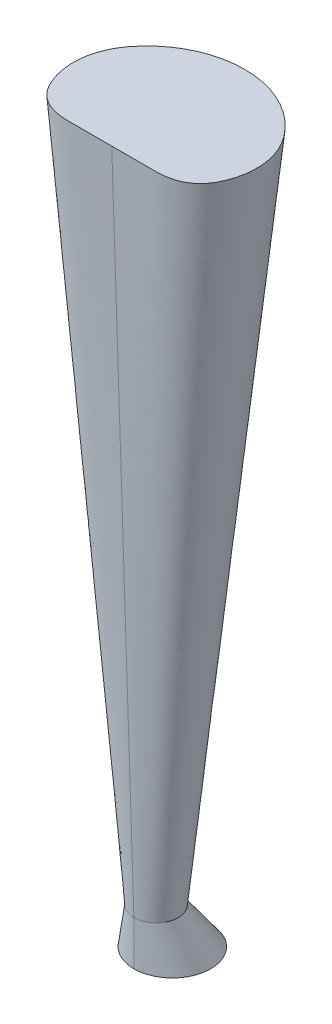
ISO-10303-21;
HEADER;
FILE_DESCRIPTION(('STEP AP214'),'2;1');
FILE_NAME('part.step','',(''),(''),'','','');
FILE_SCHEMA(('AUTOMOTIVE_DESIGN { 1 0 10303 214 1 1 1 1 }'));
ENDSEC;
DATA;
#1=APPLICATION_CONTEXT('core data for automotive mechanical design processes');
#2=APPLICATION_PROTOCOL_DEFINITION('international standard','automotive_design',2000,#1);
#3=PRODUCT_CONTEXT('',#1,'mechanical');
#4=PRODUCT('Part','Part','',(#3));
#5=PRODUCT_RELATED_PRODUCT_CATEGORY('part','',(#4));
#6=PRODUCT_DEFINITION_FORMATION('','',#4);
#7=PRODUCT_DEFINITION_CONTEXT('part definition',#1,'design');
#8=PRODUCT_DEFINITION('design','',#6,#7);
#9=PRODUCT_DEFINITION_SHAPE('','',#8);
#10=(LENGTH_UNIT() NAMED_UNIT(*) SI_UNIT(.MILLI.,.METRE.));
#11=(NAMED_UNIT(*) PLANE_ANGLE_UNIT() SI_UNIT($,.RADIAN.));
#12=(NAMED_UNIT(*) SI_UNIT($,.STERADIAN.) SOLID_ANGLE_UNIT());
#13=UNCERTAINTY_MEASURE_WITH_UNIT(LENGTH_MEASURE(1.E-05),#10,'distance_accuracy_value','');
#14=(GEOMETRIC_REPRESENTATION_CONTEXT(3) GLOBAL_UNCERTAINTY_ASSIGNED_CONTEXT((#13)) GLOBAL_UNIT_ASSIGNED_CONTEXT((#10,
#11,#12)) REPRESENTATION_CONTEXT('',''));
#15=CARTESIAN_POINT('',(0.,0.,0.));
#16=DIRECTION('',(0.,0.,1.));
#17=DIRECTION('',(1.,0.,0.));
#18=AXIS2_PLACEMENT_3D('',#15,#16,#17);
#19=CARTESIAN_POINT('',(15.,0.,-20.));
#20=DIRECTION('',(0.,1.,0.));
#21=DIRECTION('',(0.,0.,1.));
#22=AXIS2_PLACEMENT_3D('',#19,#20,#21);
#23=PLANE('',#22);
#24=DIRECTION('',(1.,0.,0.));
#25=VECTOR('',#24,1.);
#26=CARTESIAN_POINT('',(0.,0.,0.));
#27=LINE('',#26,#25);
#28=CARTESIAN_POINT('',(0.,0.,0.));
#29=VERTEX_POINT('',#28);
#30=CARTESIAN_POINT('',(15.0000000000151,0.,0.));
#31=VERTEX_POINT('',#30);
#32=EDGE_CURVE('E389',#29,#31,#27,.T.);
#33=ORIENTED_EDGE('',*,*,#32,.T.);
#34=CARTESIAN_POINT('',(15.,0.,-20.));
#35=DIRECTION('',(0.,1.,0.));
#36=DIRECTION('',(0.,0.,1.));
#37=AXIS2_PLACEMENT_3D('',#34,#35,#36);
#38=CIRCLE('',#37,20.);
#39=CARTESIAN_POINT('',(20.3291783772851,0.,-0.723074471714181));
#40=VERTEX_POINT('',#39);
#41=EDGE_CURVE('E170',#31,#40,#38,.T.);
#42=ORIENTED_EDGE('',*,*,#41,.T.);
#43=CARTESIAN_POINT('',(16.8652124320368,0.,-13.2530760650964));
#44=DIRECTION('',(0.,1.,0.));
#45=DIRECTION('',(0.,0.,1.));
#46=AXIS2_PLACEMENT_3D('',#43,#44,#45);
#47=CIRCLE('',#46,13.);
#48=CARTESIAN_POINT('',(28.3071853927902,0.,-7.08207494976761));
#49=VERTEX_POINT('',#48);
#50=EDGE_CURVE('E176',#40,#49,#47,.T.);
#51=ORIENTED_EDGE('',*,*,#50,.T.);
#52=CARTESIAN_POINT('',(8.06369476993792,0.,-18.));
#53=DIRECTION('',(0.,1.,0.));
#54=DIRECTION('',(0.,0.,1.));
#55=AXIS2_PLACEMENT_3D('',#52,#53,#54);
#56=CIRCLE('',#55,23.);
#57=CARTESIAN_POINT('',(26.4638006518201,0.,-31.7998588230287));
#58=VERTEX_POINT('',#57);
#59=EDGE_CURVE('E442',#49,#58,#56,.T.);
#60=ORIENTED_EDGE('',*,*,#59,.T.);
#61=CARTESIAN_POINT('',(0.063648734338211,0.,-12.0000613812901));
#62=DIRECTION('',(0.,1.,0.));
#63=DIRECTION('',(0.,0.,1.));
#64=AXIS2_PLACEMENT_3D('',#61,#62,#63);
#65=CIRCLE('',#64,33.);
#66=CARTESIAN_POINT('',(0.,0.,-45.));
#67=VERTEX_POINT('',#66);
#68=EDGE_CURVE('E233',#58,#67,#65,.T.);
#69=ORIENTED_EDGE('',*,*,#68,.T.);
#70=CARTESIAN_POINT('',(-0.063648734338211,0.,-12.0000613812901));
#71=DIRECTION('',(0.,-1.,0.));
#72=DIRECTION('',(0.,0.,1.));
#73=AXIS2_PLACEMENT_3D('',#70,#71,#72);
#74=CIRCLE('',#73,33.);
#75=CARTESIAN_POINT('',(-26.4638006518201,0.,-31.7998588230287));
#76=VERTEX_POINT('',#75);
#77=EDGE_CURVE('E219',#76,#67,#74,.T.);
#78=ORIENTED_EDGE('',*,*,#77,.F.);
#79=CARTESIAN_POINT('',(-8.06369476993792,0.,-18.));
#80=DIRECTION('',(0.,-1.,0.));
#81=DIRECTION('',(0.,0.,1.));
#82=AXIS2_PLACEMENT_3D('',#79,#80,#81);
#83=CIRCLE('',#82,23.);
#84=CARTESIAN_POINT('',(-28.3071853927902,0.,-7.08207494976761));
#85=VERTEX_POINT('',#84);
#86=EDGE_CURVE('E214',#85,#76,#83,.T.);
#87=ORIENTED_EDGE('',*,*,#86,.F.);
#88=CARTESIAN_POINT('',(-16.8652124320368,0.,-13.2530760650964));
#89=DIRECTION('',(0.,-1.,0.));
#90=DIRECTION('',(0.,0.,1.));
#91=AXIS2_PLACEMENT_3D('',#88,#89,#90);
#92=CIRCLE('',#91,13.);
#93=CARTESIAN_POINT('',(-20.3291783772851,0.,-0.723074471714181));
#94=VERTEX_POINT('',#93);
#95=EDGE_CURVE('E222',#94,#85,#92,.T.);
#96=ORIENTED_EDGE('',*,*,#95,.F.);
#97=CARTESIAN_POINT('',(-15.,0.,-20.));
#98=DIRECTION('',(0.,-1.,0.));
#99=DIRECTION('',(0.,0.,1.));
#100=AXIS2_PLACEMENT_3D('',#97,#98,#99);
#101=CIRCLE('',#100,20.);
#102=CARTESIAN_POINT('',(-15.0000000000151,0.,0.));
#103=VERTEX_POINT('',#102);
#104=EDGE_CURVE('E309',#103,#94,#101,.T.);
#105=ORIENTED_EDGE('',*,*,#104,.F.);
#106=DIRECTION('',(-1.,0.,0.));
#107=VECTOR('',#106,1.);
#108=CARTESIAN_POINT('',(0.,0.,0.));
#109=LINE('',#108,#107);
#110=EDGE_CURVE('E311',#29,#103,#109,.T.);
#111=ORIENTED_EDGE('',*,*,#110,.F.);
#112=EDGE_LOOP('',(#33,#42,#51,#60,#69,#78,#87,#96,#105,#111));
#113=FACE_BOUND('',#112,.T.);
#114=ADVANCED_FACE('F148',(#113),#23,.T.);
#115=CARTESIAN_POINT('',(0.,0.,-45.));
#116=CARTESIAN_POINT('',(0.,-76.6666666666667,-37.5));
#117=CARTESIAN_POINT('',(0.,-153.333333333333,-30.));
#118=CARTESIAN_POINT('',(0.,-230.,-22.5));
#119=CARTESIAN_POINT('',(2.54061818088462,0.,-45.0049002252252));
#120=CARTESIAN_POINT('',(1.92304988507446,-76.6666666666667,-37.5032668168168));
#121=CARTESIAN_POINT('',(1.3054815892643,-153.333333333333,-30.0016334084084));
#122=CARTESIAN_POINT('',(0.687913293454144,-230.,-22.5));
#123=CARTESIAN_POINT('',(7.63269115251726,0.,-44.425430276863));
#124=CARTESIAN_POINT('',(5.7753887329583,-76.6666666666666,-37.0535126543646));
#125=CARTESIAN_POINT('',(3.91808631339933,-153.333333333333,-29.6815950318663));
#126=CARTESIAN_POINT('',(2.06078389384036,-230.,-22.309677409368));
#127=CARTESIAN_POINT('',(14.8896829337407,0.,-41.8158547574642));
#128=CARTESIAN_POINT('',(11.2462518363499,-76.6666666666667,-35.037264720877));
#129=CARTESIAN_POINT('',(7.60282073895906,-153.333333333333,-28.2586746842897));
#130=CARTESIAN_POINT('',(3.95938964156821,-230.,-21.4800846477025));
#131=CARTESIAN_POINT('',(21.3666508239285,0.,-37.5944805733922));
#132=CARTESIAN_POINT('',(16.097586401742,-76.6666666666667,-31.7871727854601));
#133=CARTESIAN_POINT('',(10.8285219795554,-153.333333333333,-25.979864997528));
#134=CARTESIAN_POINT('',(5.5594575573688,-230.,-20.1725572095958));
#135=CARTESIAN_POINT('',(24.9244135068242,0.,-33.852407825476));
#136=CARTESIAN_POINT('',(18.7330546360879,-76.6666666666667,-28.9176127036124));
#137=CARTESIAN_POINT('',(12.5416957653516,-153.333333333333,-23.9828175817488));
#138=CARTESIAN_POINT('',(6.35033689461534,-230.,-19.0480224598852));
#139=CARTESIAN_POINT('',(27.7664407474718,0.,-30.062977598855));
#140=CARTESIAN_POINT('',(20.8200464331564,-76.6666666666667,-26.0192162659416));
#141=CARTESIAN_POINT('',(13.873652118841,-153.333333333333,-21.9754549330282));
#142=CARTESIAN_POINT('',(6.92725780452556,-230.,-17.9316936001147));
#143=CARTESIAN_POINT('',(29.8850820777268,0.,-26.2060729264579));
#144=CARTESIAN_POINT('',(22.3686977268434,-76.6666666666666,-23.0877421516091));
#145=CARTESIAN_POINT('',(14.8523133759601,-153.333333333333,-19.9694113767602));
#146=CARTESIAN_POINT('',(7.3359290250767,-230.,-16.8510806019114));
#147=CARTESIAN_POINT('',(31.3131258143007,0.,-19.7374181748847));
#148=CARTESIAN_POINT('',(23.3968413559959,-76.6666666666666,-18.2049076896114));
#149=CARTESIAN_POINT('',(15.4805568976912,-153.333333333333,-16.672397204338));
#150=CARTESIAN_POINT('',(7.56427243938638,-230.,-15.1398867190647));
#151=CARTESIAN_POINT('',(30.8623360018231,0.,-13.1266875994762));
#152=CARTESIAN_POINT('',(23.0413508371829,-76.6666666666667,-13.2250839163194));
#153=CARTESIAN_POINT('',(15.2203656725428,-153.333333333333,-13.3234802331626));
#154=CARTESIAN_POINT('',(7.3993805079026,-230.,-13.4218765500058));
#155=CARTESIAN_POINT('',(29.3387876883964,0.,-8.99482222559356));
#156=CARTESIAN_POINT('',(21.9029777354395,-76.6666666666667,-10.1057913916885));
#157=CARTESIAN_POINT('',(14.4671677824826,-153.333333333333,-11.2167605577835));
#158=CARTESIAN_POINT('',(7.03135782952567,-230.,-12.3277297238785));
#159=CARTESIAN_POINT('',(27.8885817855529,0.,-6.30592030877438));
#160=CARTESIAN_POINT('',(20.8213994841431,-76.6666666666667,-8.06923841159566));
#161=CARTESIAN_POINT('',(13.7542171827332,-153.333333333333,-9.83255651441695));
#162=CARTESIAN_POINT('',(6.68703488132342,-230.,-11.5958746172382));
#163=CARTESIAN_POINT('',(26.8961987569961,0.,-4.84485133656051));
#164=CARTESIAN_POINT('',(20.086706242366,-76.6666666666667,-6.95690146013182));
#165=CARTESIAN_POINT('',(13.2772137277359,-153.333333333333,-9.06895158370313));
#166=CARTESIAN_POINT('',(6.46772121310578,-230.,-11.1810017072744));
#167=CARTESIAN_POINT('',(25.0081152706939,0.,-3.0065636306176));
#168=CARTESIAN_POINT('',(18.6985688829926,-76.6666666666665,-5.53401328584436));
#169=CARTESIAN_POINT('',(12.3890224952912,-153.333333333333,-8.06146294107112));
#170=CARTESIAN_POINT('',(6.07947610758984,-230.,-10.5889125962979));
#171=CARTESIAN_POINT('',(22.7981274372171,0.,-1.58736297651796));
#172=CARTESIAN_POINT('',(17.0772346965687,-76.6666666666668,-4.40293621091142));
#173=CARTESIAN_POINT('',(11.3563419559202,-153.333333333334,-7.21850944530488));
#174=CARTESIAN_POINT('',(5.6354492152718,-230.,-10.0340826796983));
#175=CARTESIAN_POINT('',(21.1678983640901,0.,-0.954941758418507));
#176=CARTESIAN_POINT('',(15.8803574242968,-76.6666666666667,-3.86775657022274));
#177=CARTESIAN_POINT('',(10.5928164845036,-153.333333333333,-6.78057138202698));
#178=CARTESIAN_POINT('',(5.30527554471029,-230.,-9.69338619383121));
#179=CARTESIAN_POINT('',(19.8925382315249,0.,-0.602363665418462));
#180=CARTESIAN_POINT('',(14.9425798795175,-76.6666666666667,-3.55054746254298));
#181=CARTESIAN_POINT('',(9.99262152750997,-153.333333333333,-6.4987312596675));
#182=CARTESIAN_POINT('',(5.04266317550248,-230.,-9.44691505679202));
#183=CARTESIAN_POINT('',(19.0142290762486,0.,-0.391476114327585));
#184=CARTESIAN_POINT('',(14.2954858795202,-76.6666666666667,-3.35496738313731));
#185=CARTESIAN_POINT('',(9.57674268279173,-153.333333333333,-6.31845865194703));
#186=CARTESIAN_POINT('',(4.85799948606329,-230.,-9.28194992075676));
#187=CARTESIAN_POINT('',(17.6846761924425,0.,-0.165769435665736));
#188=CARTESIAN_POINT('',(13.3123200691513,-76.6666666666666,-3.12631004680459));
#189=CARTESIAN_POINT('',(8.9399639458602,-153.333333333333,-6.08685065794345));
#190=CARTESIAN_POINT('',(4.56760782256906,-230.,-9.0473912690823));
#191=CARTESIAN_POINT('',(16.3458669883333,0.,-0.0302326652869073));
#192=CARTESIAN_POINT('',(12.3189686664141,-76.6666666666666,-2.96251342224739));
#193=CARTESIAN_POINT('',(8.29207034449493,-153.333333333333,-5.89479417920788));
#194=CARTESIAN_POINT('',(4.26517202257576,-230.,-8.82707493616837));
#195=CARTESIAN_POINT('',(15.4490395192333,0.,0.));
#196=CARTESIAN_POINT('',(11.6515383315978,-76.6666666666667,-2.89682761408818));
#197=CARTESIAN_POINT('',(7.85403714396238,-153.333333333333,-5.79365522817635));
#198=CARTESIAN_POINT('',(4.05653595632693,-230.,-8.69048284226453));
#199=CARTESIAN_POINT('',(13.7495107720792,0.,0.));
#200=CARTESIAN_POINT('',(10.3850493862073,-76.6666666666667,-2.81411418258019));
#201=CARTESIAN_POINT('',(7.02058800033536,-153.333333333333,-5.62822836516038));
#202=CARTESIAN_POINT('',(3.65612661446343,-230.,-8.44234254774057));
#203=CARTESIAN_POINT('',(11.2563027082438,0.,0.));
#204=CARTESIAN_POINT('',(8.5173770048038,-76.6666666666667,-2.70564086235232));
#205=CARTESIAN_POINT('',(5.77845130136383,-153.333333333333,-5.41128172470464));
#206=CARTESIAN_POINT('',(3.03952559792385,-230.,-8.11692258705695));
#207=CARTESIAN_POINT('',(7.52281512932959,0.,0.));
#208=CARTESIAN_POINT('',(5.69984797802602,-76.6666666666666,-2.58715718717503));
#209=CARTESIAN_POINT('',(3.87688082672245,-153.333333333333,-5.17431437435007));
#210=CARTESIAN_POINT('',(2.05391367541888,-230.,-7.7614715615251));
#211=CARTESIAN_POINT('',(3.7789757879759,0.,0.));
#212=CARTESIAN_POINT('',(2.86320454156473,-76.6666666666667,-2.5156795828284));
#213=CARTESIAN_POINT('',(1.94743329515357,-153.333333333333,-5.03135916565681));
#214=CARTESIAN_POINT('',(1.0316620487424,-230.,-7.54703874848521));
#215=CARTESIAN_POINT('',(1.26476408227562,0.,0.));
#216=CARTESIAN_POINT('',(0.957327590070924,-76.6666666666667,-2.5));
#217=CARTESIAN_POINT('',(0.649891097866231,-153.333333333333,-5.));
#218=CARTESIAN_POINT('',(0.342454605661537,-230.,-7.5));
#219=CARTESIAN_POINT('',(0.,0.,0.));
#220=CARTESIAN_POINT('',(0.,-76.6666666666667,-2.5));
#221=CARTESIAN_POINT('',(0.,-153.333333333333,-5.));
#222=CARTESIAN_POINT('',(0.,-230.,-7.5));
#223=B_SPLINE_SURFACE_WITH_KNOTS('',3,3,((#115,#116,#117,#118),(#119,#120,#121,#122),(#123,#124,
#125,#126),(#127,#128,#129,#130),(#131,#132,#133,#134),(#135,#136,#137,#138),(#139,#140,#141,
#142),(#143,#144,#145,#146),(#147,#148,#149,#150),(#151,#152,#153,#154),(#155,#156,#157,#158),
(#159,#160,#161,#162),(#163,#164,#165,#166),(#167,#168,#169,#170),(#171,#172,#173,#174),(#175,
#176,#177,#178),(#179,#180,#181,#182),(#183,#184,#185,#186),(#187,#188,#189,#190),(#191,#192,
#193,#194),(#195,#196,#197,#198),(#199,#200,#201,#202),(#203,#204,#205,#206),(#207,#208,#209,
#210),(#211,#212,#213,#214),(#215,#216,#217,#218),(#219,#220,#221,#222)),.UNSPECIFIED.,.F.,.F.,
.F.,(4,1,1,1,2,1,1,1,2,1,1,1,2,1,1,1,2,1,1,1,4),(4,4),(0.,0.0872247546886241,0.174449509377248,
0.261674264065872,0.348899018754496,0.422709212009021,0.496519405263545,0.57032959851807,
0.644139791772594,0.674090493965362,0.704041196158131,0.733991898350899,0.763942600543667,
0.77953502602496,0.795127451506254,0.810719876987548,0.826312302468841,0.869734226851631,
0.913156151234421,0.95657807561721,1.),(0.,1.),.UNSPECIFIED.);
#224=DIRECTION('',(0.,-0.999468760107714,-0.0325913726122081));
#225=VECTOR('',#224,1.);
#226=CARTESIAN_POINT('',(0.,-115.,-3.75));
#227=LINE('',#226,#225);
#228=CARTESIAN_POINT('',(0.,-230.,-7.5));
#229=VERTEX_POINT('',#228);
#230=EDGE_CURVE('E162',#29,#229,#227,.T.);
#231=CARTESIAN_POINT('',(0.,-230.,-15.));
#232=DIRECTION('',(0.,1.,0.));
#233=DIRECTION('',(0.,0.,1.));
#234=AXIS2_PLACEMENT_3D('',#231,#232,#233);
#235=CIRCLE('',#234,7.5);
#236=CARTESIAN_POINT('',(0.,-230.,-22.5));
#237=VERTEX_POINT('',#236);
#238=EDGE_CURVE('E13',#229,#237,#235,.T.);
#239=DIRECTION('',(0.,0.995249100668526,-0.0973613250653993));
#240=VECTOR('',#239,1.);
#241=CARTESIAN_POINT('',(0.,-115.,-33.75));
#242=LINE('',#241,#240);
#243=EDGE_CURVE('E454',#237,#67,#242,.T.);
#244=ORIENTED_EDGE('',*,*,#68,.F.);
#245=ORIENTED_EDGE('',*,*,#59,.F.);
#246=ORIENTED_EDGE('',*,*,#50,.F.);
#247=ORIENTED_EDGE('',*,*,#41,.F.);
#248=ORIENTED_EDGE('',*,*,#32,.F.);
#249=ORIENTED_EDGE('',*,*,#230,.T.);
#250=ORIENTED_EDGE('',*,*,#238,.T.);
#251=ORIENTED_EDGE('',*,*,#243,.T.);
#252=EDGE_LOOP('',(#244,#245,#246,#247,#248,#249,#250,#251));
#253=FACE_BOUND('',#252,.T.);
#254=ADVANCED_FACE('F150',(#253),#223,.T.);
#255=CARTESIAN_POINT('',(0.,-245.,-20.5));
#256=DIRECTION('',(0.,1.,0.));
#257=DIRECTION('',(0.,0.,1.));
#258=AXIS2_PLACEMENT_3D('',#255,#256,#257);
#259=PLANE('',#258);
#260=CARTESIAN_POINT('',(0.,-245.,-7.5));
#261=CARTESIAN_POINT('',(0.54166666666667,-245.,-7.5));
#262=CARTESIAN_POINT('',(1.11752421228496,-245.,-7.53359699271673));
#263=CARTESIAN_POINT('',(2.33380322134336,-245.,-7.69649150285848));
#264=CARTESIAN_POINT('',(2.9744,-245.,-7.82586666666667));
#265=CARTESIAN_POINT('',(4.3056,-245.,-8.21413333333333));
#266=CARTESIAN_POINT('',(4.99638092833397,-245.,-8.47323570256281));
#267=CARTESIAN_POINT('',(6.39687749863233,-245.,-9.15597778058326));
#268=CARTESIAN_POINT('',(7.10666666666667,-245.,-9.58));
#269=CARTESIAN_POINT('',(8.49333333333334,-245.,-10.62));
#270=CARTESIAN_POINT('',(9.17001313567274,-245.,-11.236473384625));
#271=CARTESIAN_POINT('',(10.4190279602177,-245.,-12.6676362044161));
#272=CARTESIAN_POINT('',(10.9907727797001,-245.,-13.4826989619377));
#273=CARTESIAN_POINT('',(11.9504036908881,-245.,-15.2820069204152));
#274=CARTESIAN_POINT('',(12.3374358974359,-245.,-16.2661538461539));
#275=CARTESIAN_POINT('',(12.8625641025641,-245.,-18.3338461538462));
#276=CARTESIAN_POINT('',(13.,-245.,-19.4166666666667));
#277=CARTESIAN_POINT('',(13.,-245.,-21.5833333333333));
#278=CARTESIAN_POINT('',(12.8625641025641,-245.,-22.6661538461539));
#279=CARTESIAN_POINT('',(12.3374358974359,-245.,-24.7338461538462));
#280=CARTESIAN_POINT('',(11.9504036908881,-245.,-25.7179930795848));
#281=CARTESIAN_POINT('',(10.9907727797001,-245.,-27.5173010380623));
#282=CARTESIAN_POINT('',(10.4190279602177,-245.,-28.3323637955839));
#283=CARTESIAN_POINT('',(9.17001313567274,-245.,-29.763526615375));
#284=CARTESIAN_POINT('',(8.49333333333333,-245.,-30.38));
#285=CARTESIAN_POINT('',(7.10666666666667,-245.,-31.42));
#286=CARTESIAN_POINT('',(6.39687749863233,-245.,-31.8440222194167));
#287=CARTESIAN_POINT('',(4.99638092833397,-245.,-32.5267642974372));
#288=CARTESIAN_POINT('',(4.3056,-245.,-32.7858666666667));
#289=CARTESIAN_POINT('',(2.9744,-245.,-33.1741333333333));
#290=CARTESIAN_POINT('',(2.33380322134336,-245.,-33.3035084971415));
#291=CARTESIAN_POINT('',(1.11752421228496,-245.,-33.4664030072833));
#292=CARTESIAN_POINT('',(0.541666666666668,-245.,-33.5));
#293=CARTESIAN_POINT('',(0.,-245.,-33.5));
#294=B_SPLINE_CURVE_WITH_KNOTS('',3,(#260,#261,#262,#263,#264,#265,#266,#267,#268,#269,#270,
#271,#272,#273,#274,#275,#276,#277,#278,#279,#280,#281,#282,#283,#284,#285,#286,#287,#288,#289,
#290,#291,#292,#293),.UNSPECIFIED.,.F.,.F.,(4,2,2,2,2,2,2,2,2,2,2,2,2,2,2,2,4),(0.,
0.0625000000000001,0.125,0.1875,0.25,0.3125,0.375,0.4375,0.5,0.5625,0.625,0.6875,0.75,0.8125,
0.875,0.9375,1.),.UNSPECIFIED.);
#295=CARTESIAN_POINT('',(0.,-245.,-7.5));
#296=VERTEX_POINT('',#295);
#297=CARTESIAN_POINT('',(0.,-245.,-33.5));
#298=VERTEX_POINT('',#297);
#299=EDGE_CURVE('E473',#296,#298,#294,.T.);
#300=ORIENTED_EDGE('',*,*,#299,.F.);
#301=CARTESIAN_POINT('',(0.,-245.,-33.5));
#302=CARTESIAN_POINT('',(-0.541666666666668,-245.,-33.5));
#303=CARTESIAN_POINT('',(-1.11752421228496,-245.,-33.4664030072833));
#304=CARTESIAN_POINT('',(-2.33380322134336,-245.,-33.3035084971415));
#305=CARTESIAN_POINT('',(-2.9744,-245.,-33.1741333333333));
#306=CARTESIAN_POINT('',(-4.3056,-245.,-32.7858666666667));
#307=CARTESIAN_POINT('',(-4.99638092833397,-245.,-32.5267642974372));
#308=CARTESIAN_POINT('',(-6.39687749863233,-245.,-31.8440222194167));
#309=CARTESIAN_POINT('',(-7.10666666666667,-245.,-31.42));
#310=CARTESIAN_POINT('',(-8.49333333333333,-245.,-30.38));
#311=CARTESIAN_POINT('',(-9.17001313567274,-245.,-29.763526615375));
#312=CARTESIAN_POINT('',(-10.4190279602177,-245.,-28.3323637955839));
#313=CARTESIAN_POINT('',(-10.9907727797001,-245.,-27.5173010380623));
#314=CARTESIAN_POINT('',(-11.9504036908881,-245.,-25.7179930795848));
#315=CARTESIAN_POINT('',(-12.3374358974359,-245.,-24.7338461538462));
#316=CARTESIAN_POINT('',(-12.8625641025641,-245.,-22.6661538461539));
#317=CARTESIAN_POINT('',(-13.,-245.,-21.5833333333333));
#318=CARTESIAN_POINT('',(-13.,-245.,-19.4166666666667));
#319=CARTESIAN_POINT('',(-12.8625641025641,-245.,-18.3338461538462));
#320=CARTESIAN_POINT('',(-12.3374358974359,-245.,-16.2661538461539));
#321=CARTESIAN_POINT('',(-11.9504036908881,-245.,-15.2820069204152));
#322=CARTESIAN_POINT('',(-10.9907727797001,-245.,-13.4826989619377));
#323=CARTESIAN_POINT('',(-10.4190279602177,-245.,-12.6676362044161));
#324=CARTESIAN_POINT('',(-9.17001313567274,-245.,-11.236473384625));
#325=CARTESIAN_POINT('',(-8.49333333333334,-245.,-10.62));
#326=CARTESIAN_POINT('',(-7.10666666666667,-245.,-9.58));
#327=CARTESIAN_POINT('',(-6.39687749863233,-245.,-9.15597778058326));
#328=CARTESIAN_POINT('',(-4.99638092833397,-245.,-8.47323570256281));
#329=CARTESIAN_POINT('',(-4.3056,-245.,-8.21413333333333));
#330=CARTESIAN_POINT('',(-2.9744,-245.,-7.82586666666667));
#331=CARTESIAN_POINT('',(-2.33380322134336,-245.,-7.69649150285848));
#332=CARTESIAN_POINT('',(-1.11752421228496,-245.,-7.53359699271673));
#333=CARTESIAN_POINT('',(-0.54166666666667,-245.,-7.5));
#334=CARTESIAN_POINT('',(0.,-245.,-7.5));
#335=B_SPLINE_CURVE_WITH_KNOTS('',3,(#301,#302,#303,#304,#305,#306,#307,#308,#309,#310,#311,
#312,#313,#314,#315,#316,#317,#318,#319,#320,#321,#322,#323,#324,#325,#326,#327,#328,#329,#330,
#331,#332,#333,#334),.UNSPECIFIED.,.F.,.F.,(4,2,2,2,2,2,2,2,2,2,2,2,2,2,2,2,4),(0.,0.0625,0.125,
0.1875,0.25,0.3125,0.375,0.4375,0.5,0.5625,0.625,0.6875,0.75,0.8125,0.875,0.9375,1.),.UNSPECIFIED.);
#336=EDGE_CURVE('E319',#296,#298,#335,.F.);
#337=ORIENTED_EDGE('',*,*,#336,.T.);
#338=EDGE_LOOP('',(#300,#337));
#339=FACE_BOUND('',#338,.T.);
#340=ADVANCED_FACE('F344',(#339),#259,.F.);
#341=CARTESIAN_POINT('',(0.,-245.,-7.5));
#342=CARTESIAN_POINT('',(0.,-230.,-7.5));
#343=CARTESIAN_POINT('',(0.54166666666667,-245.,-7.5));
#344=CARTESIAN_POINT('',(0.312500000000003,-230.,-7.5));
#345=CARTESIAN_POINT('',(1.11752421228496,-245.,-7.53359699271673));
#346=CARTESIAN_POINT('',(0.645500000000004,-230.,-7.519));
#347=CARTESIAN_POINT('',(2.33380322134336,-245.,-7.69649150285848));
#348=CARTESIAN_POINT('',(1.34725,-230.,-7.613));
#349=CARTESIAN_POINT('',(2.9744,-245.,-7.82586666666667));
#350=CARTESIAN_POINT('',(1.716,-230.,-7.688));
#351=CARTESIAN_POINT('',(4.3056,-245.,-8.21413333333333));
#352=CARTESIAN_POINT('',(2.484,-230.,-7.912));
#353=CARTESIAN_POINT('',(4.99638092833397,-245.,-8.47323570256281));
#354=CARTESIAN_POINT('',(2.88252745865421,-230.,-8.06148213609393));
#355=CARTESIAN_POINT('',(6.39687749863233,-245.,-9.15597778058326));
#356=CARTESIAN_POINT('',(3.69050624921096,-230.,-8.45537179649035));
#357=CARTESIAN_POINT('',(7.10666666666667,-245.,-9.58));
#358=CARTESIAN_POINT('',(4.1,-230.,-8.7));
#359=CARTESIAN_POINT('',(8.49333333333334,-245.,-10.62));
#360=CARTESIAN_POINT('',(4.9,-230.,-9.3));
#361=CARTESIAN_POINT('',(9.17001313567274,-245.,-11.236473384625));
#362=CARTESIAN_POINT('',(5.29039219365735,-230.,-9.65565772189904));
#363=CARTESIAN_POINT('',(10.4190279602177,-245.,-12.6676362044161));
#364=CARTESIAN_POINT('',(6.01097766935635,-230.,-10.4813285794708));
#365=CARTESIAN_POINT('',(10.9907727797001,-245.,-13.4826989619377));
#366=CARTESIAN_POINT('',(6.34083044982699,-230.,-10.9515570934256));
#367=CARTESIAN_POINT('',(11.9504036908881,-245.,-15.2820069204152));
#368=CARTESIAN_POINT('',(6.89446366782007,-230.,-11.9896193771626));
#369=CARTESIAN_POINT('',(12.3374358974359,-245.,-16.2661538461539));
#370=CARTESIAN_POINT('',(7.11775147928994,-230.,-12.5573964497041));
#371=CARTESIAN_POINT('',(12.8625641025641,-245.,-18.3338461538462));
#372=CARTESIAN_POINT('',(7.4207100591716,-230.,-13.7502958579882));
#373=CARTESIAN_POINT('',(13.,-245.,-19.4166666666667));
#374=CARTESIAN_POINT('',(7.5,-230.,-14.375));
#375=CARTESIAN_POINT('',(13.,-245.,-21.5833333333333));
#376=CARTESIAN_POINT('',(7.5,-230.,-15.625));
#377=CARTESIAN_POINT('',(12.8625641025641,-245.,-22.6661538461539));
#378=CARTESIAN_POINT('',(7.4207100591716,-230.,-16.2497041420118));
#379=CARTESIAN_POINT('',(12.3374358974359,-245.,-24.7338461538462));
#380=CARTESIAN_POINT('',(7.11775147928994,-230.,-17.4426035502958));
#381=CARTESIAN_POINT('',(11.9504036908881,-245.,-25.7179930795848));
#382=CARTESIAN_POINT('',(6.89446366782007,-230.,-18.0103806228374));
#383=CARTESIAN_POINT('',(10.9907727797001,-245.,-27.5173010380623));
#384=CARTESIAN_POINT('',(6.34083044982699,-230.,-19.0484429065744));
#385=CARTESIAN_POINT('',(10.4190279602177,-245.,-28.3323637955839));
#386=CARTESIAN_POINT('',(6.01097766935635,-230.,-19.5186714205292));
#387=CARTESIAN_POINT('',(9.17001313567274,-245.,-29.763526615375));
#388=CARTESIAN_POINT('',(5.29039219365735,-230.,-20.3443422781009));
#389=CARTESIAN_POINT('',(8.49333333333333,-245.,-30.38));
#390=CARTESIAN_POINT('',(4.9,-230.,-20.7));
#391=CARTESIAN_POINT('',(7.10666666666667,-245.,-31.42));
#392=CARTESIAN_POINT('',(4.1,-230.,-21.3));
#393=CARTESIAN_POINT('',(6.39687749863233,-245.,-31.8440222194167));
#394=CARTESIAN_POINT('',(3.69050624921096,-230.,-21.5446282035097));
#395=CARTESIAN_POINT('',(4.99638092833397,-245.,-32.5267642974372));
#396=CARTESIAN_POINT('',(2.88252745865421,-230.,-21.9385178639061));
#397=CARTESIAN_POINT('',(4.3056,-245.,-32.7858666666667));
#398=CARTESIAN_POINT('',(2.484,-230.,-22.088));
#399=CARTESIAN_POINT('',(2.9744,-245.,-33.1741333333333));
#400=CARTESIAN_POINT('',(1.716,-230.,-22.312));
#401=CARTESIAN_POINT('',(2.33380322134336,-245.,-33.3035084971415));
#402=CARTESIAN_POINT('',(1.34725,-230.,-22.387));
#403=CARTESIAN_POINT('',(1.11752421228496,-245.,-33.4664030072833));
#404=CARTESIAN_POINT('',(0.6455,-230.,-22.481));
#405=CARTESIAN_POINT('',(0.541666666666668,-245.,-33.5));
#406=CARTESIAN_POINT('',(0.312500000000001,-230.,-22.5));
#407=CARTESIAN_POINT('',(0.,-245.,-33.5));
#408=CARTESIAN_POINT('',(0.,-230.,-22.5));
#409=B_SPLINE_SURFACE_WITH_KNOTS('',3,1,((#341,#342),(#343,#344),(#345,#346),(#347,#348),(#349,
#350),(#351,#352),(#353,#354),(#355,#356),(#357,#358),(#359,#360),(#361,#362),(#363,#364),(#365,
#366),(#367,#368),(#369,#370),(#371,#372),(#373,#374),(#375,#376),(#377,#378),(#379,#380),(#381,
#382),(#383,#384),(#385,#386),(#387,#388),(#389,#390),(#391,#392),(#393,#394),(#395,#396),(#397,
#398),(#399,#400),(#401,#402),(#403,#404),(#405,#406),(#407,#408)),.UNSPECIFIED.,.F.,.F.,.F.,(4,
2,2,2,2,2,2,2,2,2,2,2,2,2,2,2,4),(2,2),(0.,0.0625000000000001,0.125,0.1875,0.25,0.3125,0.375,
0.4375,0.5,0.5625,0.625,0.6875,0.75,0.8125,0.875,0.9375,1.),(0.,1.),.UNSPECIFIED.);
#410=CARTESIAN_POINT('',(0.,-245.,-33.5));
#411=CARTESIAN_POINT('',(0.,-230.,-22.5));
#412=B_SPLINE_CURVE_WITH_KNOTS('',1,(#410,#411),.UNSPECIFIED.,.F.,.F.,(2,2),(0.,1.),.UNSPECIFIED.);
#413=EDGE_CURVE('E392',#298,#237,#412,.T.);
#414=CARTESIAN_POINT('',(0.,-245.,-7.5));
#415=CARTESIAN_POINT('',(0.,-230.,-7.5));
#416=B_SPLINE_CURVE_WITH_KNOTS('',1,(#414,#415),.UNSPECIFIED.,.F.,.F.,(2,2),(0.,1.),.UNSPECIFIED.);
#417=EDGE_CURVE('E486',#296,#229,#416,.T.);
#418=ORIENTED_EDGE('',*,*,#299,.T.);
#419=ORIENTED_EDGE('',*,*,#413,.T.);
#420=ORIENTED_EDGE('',*,*,#238,.F.);
#421=ORIENTED_EDGE('',*,*,#417,.F.);
#422=EDGE_LOOP('',(#418,#419,#420,#421));
#423=FACE_BOUND('',#422,.T.);
#424=ADVANCED_FACE('F254',(#423),#409,.T.);
#425=CARTESIAN_POINT('',(0.,0.,-45.));
#426=CARTESIAN_POINT('',(0.,-76.6666666666667,-37.5));
#427=CARTESIAN_POINT('',(0.,-153.333333333333,-30.));
#428=CARTESIAN_POINT('',(0.,-230.,-22.5));
#429=CARTESIAN_POINT('',(-2.54061818088462,0.,-45.0049002252252));
#430=CARTESIAN_POINT('',(-1.92304988507446,-76.6666666666667,-37.5032668168168));
#431=CARTESIAN_POINT('',(-1.3054815892643,-153.333333333333,-30.0016334084084));
#432=CARTESIAN_POINT('',(-0.687913293454144,-230.,-22.5));
#433=CARTESIAN_POINT('',(-7.63269115251726,0.,-44.425430276863));
#434=CARTESIAN_POINT('',(-5.7753887329583,-76.6666666666666,-37.0535126543646));
#435=CARTESIAN_POINT('',(-3.91808631339933,-153.333333333333,-29.6815950318663));
#436=CARTESIAN_POINT('',(-2.06078389384036,-230.,-22.309677409368));
#437=CARTESIAN_POINT('',(-14.8896829337407,0.,-41.8158547574642));
#438=CARTESIAN_POINT('',(-11.2462518363499,-76.6666666666667,-35.037264720877));
#439=CARTESIAN_POINT('',(-7.60282073895906,-153.333333333333,-28.2586746842897));
#440=CARTESIAN_POINT('',(-3.95938964156821,-230.,-21.4800846477025));
#441=CARTESIAN_POINT('',(-21.3666508239285,0.,-37.5944805733922));
#442=CARTESIAN_POINT('',(-16.097586401742,-76.6666666666667,-31.7871727854601));
#443=CARTESIAN_POINT('',(-10.8285219795554,-153.333333333333,-25.979864997528));
#444=CARTESIAN_POINT('',(-5.5594575573688,-230.,-20.1725572095958));
#445=CARTESIAN_POINT('',(-24.9244135068242,0.,-33.852407825476));
#446=CARTESIAN_POINT('',(-18.7330546360879,-76.6666666666667,-28.9176127036124));
#447=CARTESIAN_POINT('',(-12.5416957653516,-153.333333333333,-23.9828175817488));
#448=CARTESIAN_POINT('',(-6.35033689461534,-230.,-19.0480224598852));
#449=CARTESIAN_POINT('',(-27.7664407474718,0.,-30.062977598855));
#450=CARTESIAN_POINT('',(-20.8200464331564,-76.6666666666667,-26.0192162659416));
#451=CARTESIAN_POINT('',(-13.873652118841,-153.333333333333,-21.9754549330282));
#452=CARTESIAN_POINT('',(-6.92725780452556,-230.,-17.9316936001147));
#453=CARTESIAN_POINT('',(-29.8850820777268,0.,-26.2060729264579));
#454=CARTESIAN_POINT('',(-22.3686977268434,-76.6666666666666,-23.0877421516091));
#455=CARTESIAN_POINT('',(-14.8523133759601,-153.333333333333,-19.9694113767602));
#456=CARTESIAN_POINT('',(-7.3359290250767,-230.,-16.8510806019114));
#457=CARTESIAN_POINT('',(-31.3131258143007,0.,-19.7374181748847));
#458=CARTESIAN_POINT('',(-23.3968413559959,-76.6666666666666,-18.2049076896114));
#459=CARTESIAN_POINT('',(-15.4805568976912,-153.333333333333,-16.672397204338));
#460=CARTESIAN_POINT('',(-7.56427243938638,-230.,-15.1398867190647));
#461=CARTESIAN_POINT('',(-30.8623360018231,0.,-13.1266875994762));
#462=CARTESIAN_POINT('',(-23.0413508371829,-76.6666666666667,-13.2250839163194));
#463=CARTESIAN_POINT('',(-15.2203656725428,-153.333333333333,-13.3234802331626));
#464=CARTESIAN_POINT('',(-7.3993805079026,-230.,-13.4218765500058));
#465=CARTESIAN_POINT('',(-29.3387876883964,0.,-8.99482222559356));
#466=CARTESIAN_POINT('',(-21.9029777354395,-76.6666666666667,-10.1057913916885));
#467=CARTESIAN_POINT('',(-14.4671677824826,-153.333333333333,-11.2167605577835));
#468=CARTESIAN_POINT('',(-7.03135782952567,-230.,-12.3277297238785));
#469=CARTESIAN_POINT('',(-27.8885817855529,0.,-6.30592030877438));
#470=CARTESIAN_POINT('',(-20.8213994841431,-76.6666666666667,-8.06923841159566));
#471=CARTESIAN_POINT('',(-13.7542171827332,-153.333333333333,-9.83255651441695));
#472=CARTESIAN_POINT('',(-6.68703488132342,-230.,-11.5958746172382));
#473=CARTESIAN_POINT('',(-26.8961987569961,0.,-4.84485133656051));
#474=CARTESIAN_POINT('',(-20.086706242366,-76.6666666666667,-6.95690146013182));
#475=CARTESIAN_POINT('',(-13.2772137277359,-153.333333333333,-9.06895158370313));
#476=CARTESIAN_POINT('',(-6.46772121310578,-230.,-11.1810017072744));
#477=CARTESIAN_POINT('',(-25.0081152706939,0.,-3.0065636306176));
#478=CARTESIAN_POINT('',(-18.6985688829926,-76.6666666666665,-5.53401328584436));
#479=CARTESIAN_POINT('',(-12.3890224952912,-153.333333333333,-8.06146294107112));
#480=CARTESIAN_POINT('',(-6.07947610758984,-230.,-10.5889125962979));
#481=CARTESIAN_POINT('',(-22.7981274372171,0.,-1.58736297651796));
#482=CARTESIAN_POINT('',(-17.0772346965687,-76.6666666666668,-4.40293621091142));
#483=CARTESIAN_POINT('',(-11.3563419559202,-153.333333333334,-7.21850944530488));
#484=CARTESIAN_POINT('',(-5.6354492152718,-230.,-10.0340826796983));
#485=CARTESIAN_POINT('',(-21.1678983640901,0.,-0.954941758418507));
#486=CARTESIAN_POINT('',(-15.8803574242968,-76.6666666666667,-3.86775657022274));
#487=CARTESIAN_POINT('',(-10.5928164845036,-153.333333333333,-6.78057138202698));
#488=CARTESIAN_POINT('',(-5.30527554471029,-230.,-9.69338619383121));
#489=CARTESIAN_POINT('',(-19.8925382315249,0.,-0.602363665418462));
#490=CARTESIAN_POINT('',(-14.9425798795175,-76.6666666666667,-3.55054746254298));
#491=CARTESIAN_POINT('',(-9.99262152750997,-153.333333333333,-6.4987312596675));
#492=CARTESIAN_POINT('',(-5.04266317550248,-230.,-9.44691505679202));
#493=CARTESIAN_POINT('',(-19.0142290762486,0.,-0.391476114327585));
#494=CARTESIAN_POINT('',(-14.2954858795202,-76.6666666666667,-3.35496738313731));
#495=CARTESIAN_POINT('',(-9.57674268279173,-153.333333333333,-6.31845865194703));
#496=CARTESIAN_POINT('',(-4.85799948606329,-230.,-9.28194992075676));
#497=CARTESIAN_POINT('',(-17.6846761924425,0.,-0.165769435665736));
#498=CARTESIAN_POINT('',(-13.3123200691513,-76.6666666666666,-3.12631004680459));
#499=CARTESIAN_POINT('',(-8.9399639458602,-153.333333333333,-6.08685065794345));
#500=CARTESIAN_POINT('',(-4.56760782256906,-230.,-9.0473912690823));
#501=CARTESIAN_POINT('',(-16.3458669883333,0.,-0.0302326652869073));
#502=CARTESIAN_POINT('',(-12.3189686664141,-76.6666666666666,-2.96251342224739));
#503=CARTESIAN_POINT('',(-8.29207034449493,-153.333333333333,-5.89479417920788));
#504=CARTESIAN_POINT('',(-4.26517202257576,-230.,-8.82707493616837));
#505=CARTESIAN_POINT('',(-15.4490395192333,0.,0.));
#506=CARTESIAN_POINT('',(-11.6515383315978,-76.6666666666667,-2.89682761408818));
#507=CARTESIAN_POINT('',(-7.85403714396238,-153.333333333333,-5.79365522817635));
#508=CARTESIAN_POINT('',(-4.05653595632693,-230.,-8.69048284226453));
#509=CARTESIAN_POINT('',(-13.7495107720792,0.,0.));
#510=CARTESIAN_POINT('',(-10.3850493862073,-76.6666666666667,-2.81411418258019));
#511=CARTESIAN_POINT('',(-7.02058800033536,-153.333333333333,-5.62822836516038));
#512=CARTESIAN_POINT('',(-3.65612661446343,-230.,-8.44234254774057));
#513=CARTESIAN_POINT('',(-11.2563027082438,0.,0.));
#514=CARTESIAN_POINT('',(-8.5173770048038,-76.6666666666667,-2.70564086235232));
#515=CARTESIAN_POINT('',(-5.77845130136383,-153.333333333333,-5.41128172470464));
#516=CARTESIAN_POINT('',(-3.03952559792385,-230.,-8.11692258705695));
#517=CARTESIAN_POINT('',(-7.52281512932959,0.,0.));
#518=CARTESIAN_POINT('',(-5.69984797802602,-76.6666666666666,-2.58715718717503));
#519=CARTESIAN_POINT('',(-3.87688082672245,-153.333333333333,-5.17431437435007));
#520=CARTESIAN_POINT('',(-2.05391367541888,-230.,-7.7614715615251));
#521=CARTESIAN_POINT('',(-3.7789757879759,0.,0.));
#522=CARTESIAN_POINT('',(-2.86320454156473,-76.6666666666667,-2.5156795828284));
#523=CARTESIAN_POINT('',(-1.94743329515357,-153.333333333333,-5.03135916565681));
#524=CARTESIAN_POINT('',(-1.0316620487424,-230.,-7.54703874848521));
#525=CARTESIAN_POINT('',(-1.26476408227562,0.,0.));
#526=CARTESIAN_POINT('',(-0.957327590070924,-76.6666666666667,-2.5));
#527=CARTESIAN_POINT('',(-0.649891097866231,-153.333333333333,-5.));
#528=CARTESIAN_POINT('',(-0.342454605661537,-230.,-7.5));
#529=CARTESIAN_POINT('',(0.,0.,0.));
#530=CARTESIAN_POINT('',(0.,-76.6666666666667,-2.5));
#531=CARTESIAN_POINT('',(0.,-153.333333333333,-5.));
#532=CARTESIAN_POINT('',(0.,-230.,-7.5));
#533=B_SPLINE_SURFACE_WITH_KNOTS('',3,3,((#425,#426,#427,#428),(#429,#430,#431,#432),(#433,#434,
#435,#436),(#437,#438,#439,#440),(#441,#442,#443,#444),(#445,#446,#447,#448),(#449,#450,#451,
#452),(#453,#454,#455,#456),(#457,#458,#459,#460),(#461,#462,#463,#464),(#465,#466,#467,#468),
(#469,#470,#471,#472),(#473,#474,#475,#476),(#477,#478,#479,#480),(#481,#482,#483,#484),(#485,
#486,#487,#488),(#489,#490,#491,#492),(#493,#494,#495,#496),(#497,#498,#499,#500),(#501,#502,
#503,#504),(#505,#506,#507,#508),(#509,#510,#511,#512),(#513,#514,#515,#516),(#517,#518,#519,
#520),(#521,#522,#523,#524),(#525,#526,#527,#528),(#529,#530,#531,#532)),.UNSPECIFIED.,.F.,.F.,
.F.,(4,1,1,1,2,1,1,1,2,1,1,1,2,1,1,1,2,1,1,1,4),(4,4),(0.,0.0872247546886241,0.174449509377248,
0.261674264065872,0.348899018754496,0.422709212009021,0.496519405263545,0.57032959851807,
0.644139791772594,0.674090493965362,0.704041196158131,0.733991898350899,0.763942600543667,
0.77953502602496,0.795127451506254,0.810719876987548,0.826312302468841,0.869734226851631,
0.913156151234421,0.95657807561721,1.),(0.,1.),.UNSPECIFIED.);
#534=CARTESIAN_POINT('',(0.,-230.,-15.));
#535=DIRECTION('',(0.,-1.,0.));
#536=DIRECTION('',(0.,0.,1.));
#537=AXIS2_PLACEMENT_3D('',#534,#535,#536);
#538=CIRCLE('',#537,7.5);
#539=EDGE_CURVE('E236',#229,#237,#538,.T.);
#540=ORIENTED_EDGE('',*,*,#77,.T.);
#541=ORIENTED_EDGE('',*,*,#243,.F.);
#542=ORIENTED_EDGE('',*,*,#539,.F.);
#543=ORIENTED_EDGE('',*,*,#230,.F.);
#544=ORIENTED_EDGE('',*,*,#110,.T.);
#545=ORIENTED_EDGE('',*,*,#104,.T.);
#546=ORIENTED_EDGE('',*,*,#95,.T.);
#547=ORIENTED_EDGE('',*,*,#86,.T.);
#548=EDGE_LOOP('',(#540,#541,#542,#543,#544,#545,#546,#547));
#549=FACE_BOUND('',#548,.T.);
#550=ADVANCED_FACE('F217',(#549),#533,.F.);
#551=CARTESIAN_POINT('',(0.,-245.,-7.5));
#552=CARTESIAN_POINT('',(0.,-230.,-7.5));
#553=CARTESIAN_POINT('',(-0.54166666666667,-245.,-7.5));
#554=CARTESIAN_POINT('',(-0.312500000000003,-230.,-7.5));
#555=CARTESIAN_POINT('',(-1.11752421228496,-245.,-7.53359699271673));
#556=CARTESIAN_POINT('',(-0.645500000000004,-230.,-7.519));
#557=CARTESIAN_POINT('',(-2.33380322134336,-245.,-7.69649150285848));
#558=CARTESIAN_POINT('',(-1.34725,-230.,-7.613));
#559=CARTESIAN_POINT('',(-2.9744,-245.,-7.82586666666667));
#560=CARTESIAN_POINT('',(-1.716,-230.,-7.688));
#561=CARTESIAN_POINT('',(-4.3056,-245.,-8.21413333333333));
#562=CARTESIAN_POINT('',(-2.484,-230.,-7.912));
#563=CARTESIAN_POINT('',(-4.99638092833397,-245.,-8.47323570256281));
#564=CARTESIAN_POINT('',(-2.88252745865421,-230.,-8.06148213609393));
#565=CARTESIAN_POINT('',(-6.39687749863233,-245.,-9.15597778058326));
#566=CARTESIAN_POINT('',(-3.69050624921096,-230.,-8.45537179649035));
#567=CARTESIAN_POINT('',(-7.10666666666667,-245.,-9.58));
#568=CARTESIAN_POINT('',(-4.1,-230.,-8.7));
#569=CARTESIAN_POINT('',(-8.49333333333334,-245.,-10.62));
#570=CARTESIAN_POINT('',(-4.9,-230.,-9.3));
#571=CARTESIAN_POINT('',(-9.17001313567274,-245.,-11.236473384625));
#572=CARTESIAN_POINT('',(-5.29039219365735,-230.,-9.65565772189904));
#573=CARTESIAN_POINT('',(-10.4190279602177,-245.,-12.6676362044161));
#574=CARTESIAN_POINT('',(-6.01097766935635,-230.,-10.4813285794708));
#575=CARTESIAN_POINT('',(-10.9907727797001,-245.,-13.4826989619377));
#576=CARTESIAN_POINT('',(-6.34083044982699,-230.,-10.9515570934256));
#577=CARTESIAN_POINT('',(-11.9504036908881,-245.,-15.2820069204152));
#578=CARTESIAN_POINT('',(-6.89446366782007,-230.,-11.9896193771626));
#579=CARTESIAN_POINT('',(-12.3374358974359,-245.,-16.2661538461539));
#580=CARTESIAN_POINT('',(-7.11775147928994,-230.,-12.5573964497041));
#581=CARTESIAN_POINT('',(-12.8625641025641,-245.,-18.3338461538462));
#582=CARTESIAN_POINT('',(-7.4207100591716,-230.,-13.7502958579882));
#583=CARTESIAN_POINT('',(-13.,-245.,-19.4166666666667));
#584=CARTESIAN_POINT('',(-7.5,-230.,-14.375));
#585=CARTESIAN_POINT('',(-13.,-245.,-21.5833333333333));
#586=CARTESIAN_POINT('',(-7.5,-230.,-15.625));
#587=CARTESIAN_POINT('',(-12.8625641025641,-245.,-22.6661538461539));
#588=CARTESIAN_POINT('',(-7.4207100591716,-230.,-16.2497041420118));
#589=CARTESIAN_POINT('',(-12.3374358974359,-245.,-24.7338461538462));
#590=CARTESIAN_POINT('',(-7.11775147928994,-230.,-17.4426035502958));
#591=CARTESIAN_POINT('',(-11.9504036908881,-245.,-25.7179930795848));
#592=CARTESIAN_POINT('',(-6.89446366782007,-230.,-18.0103806228374));
#593=CARTESIAN_POINT('',(-10.9907727797001,-245.,-27.5173010380623));
#594=CARTESIAN_POINT('',(-6.34083044982699,-230.,-19.0484429065744));
#595=CARTESIAN_POINT('',(-10.4190279602177,-245.,-28.3323637955839));
#596=CARTESIAN_POINT('',(-6.01097766935635,-230.,-19.5186714205292));
#597=CARTESIAN_POINT('',(-9.17001313567274,-245.,-29.763526615375));
#598=CARTESIAN_POINT('',(-5.29039219365735,-230.,-20.3443422781009));
#599=CARTESIAN_POINT('',(-8.49333333333333,-245.,-30.38));
#600=CARTESIAN_POINT('',(-4.9,-230.,-20.7));
#601=CARTESIAN_POINT('',(-7.10666666666667,-245.,-31.42));
#602=CARTESIAN_POINT('',(-4.1,-230.,-21.3));
#603=CARTESIAN_POINT('',(-6.39687749863233,-245.,-31.8440222194167));
#604=CARTESIAN_POINT('',(-3.69050624921096,-230.,-21.5446282035097));
#605=CARTESIAN_POINT('',(-4.99638092833397,-245.,-32.5267642974372));
#606=CARTESIAN_POINT('',(-2.88252745865421,-230.,-21.9385178639061));
#607=CARTESIAN_POINT('',(-4.3056,-245.,-32.7858666666667));
#608=CARTESIAN_POINT('',(-2.484,-230.,-22.088));
#609=CARTESIAN_POINT('',(-2.9744,-245.,-33.1741333333333));
#610=CARTESIAN_POINT('',(-1.716,-230.,-22.312));
#611=CARTESIAN_POINT('',(-2.33380322134336,-245.,-33.3035084971415));
#612=CARTESIAN_POINT('',(-1.34725,-230.,-22.387));
#613=CARTESIAN_POINT('',(-1.11752421228496,-245.,-33.4664030072833));
#614=CARTESIAN_POINT('',(-0.6455,-230.,-22.481));
#615=CARTESIAN_POINT('',(-0.541666666666668,-245.,-33.5));
#616=CARTESIAN_POINT('',(-0.312500000000001,-230.,-22.5));
#617=CARTESIAN_POINT('',(0.,-245.,-33.5));
#618=CARTESIAN_POINT('',(0.,-230.,-22.5));
#619=B_SPLINE_SURFACE_WITH_KNOTS('',3,1,((#551,#552),(#553,#554),(#555,#556),(#557,#558),(#559,
#560),(#561,#562),(#563,#564),(#565,#566),(#567,#568),(#569,#570),(#571,#572),(#573,#574),(#575,
#576),(#577,#578),(#579,#580),(#581,#582),(#583,#584),(#585,#586),(#587,#588),(#589,#590),(#591,
#592),(#593,#594),(#595,#596),(#597,#598),(#599,#600),(#601,#602),(#603,#604),(#605,#606),(#607,
#608),(#609,#610),(#611,#612),(#613,#614),(#615,#616),(#617,#618)),.UNSPECIFIED.,.F.,.F.,.F.,(4,
2,2,2,2,2,2,2,2,2,2,2,2,2,2,2,4),(2,2),(0.,0.0625000000000001,0.125,0.1875,0.25,0.3125,0.375,
0.4375,0.5,0.5625,0.625,0.6875,0.75,0.8125,0.875,0.9375,1.),(0.,1.),.UNSPECIFIED.);
#620=ORIENTED_EDGE('',*,*,#336,.F.);
#621=ORIENTED_EDGE('',*,*,#417,.T.);
#622=ORIENTED_EDGE('',*,*,#539,.T.);
#623=ORIENTED_EDGE('',*,*,#413,.F.);
#624=EDGE_LOOP('',(#620,#621,#622,#623));
#625=FACE_BOUND('',#624,.T.);
#626=ADVANCED_FACE('F340',(#625),#619,.F.);
#627=CLOSED_SHELL('',(#114,#254,#340,#424,#550,#626));
#628=MANIFOLD_SOLID_BREP('B2',#627);
#629=ADVANCED_BREP_SHAPE_REPRESENTATION('',(#18,#628),#14);
#630=SHAPE_DEFINITION_REPRESENTATION(#9,#629);
ENDSEC;
END-ISO-10303-21;
